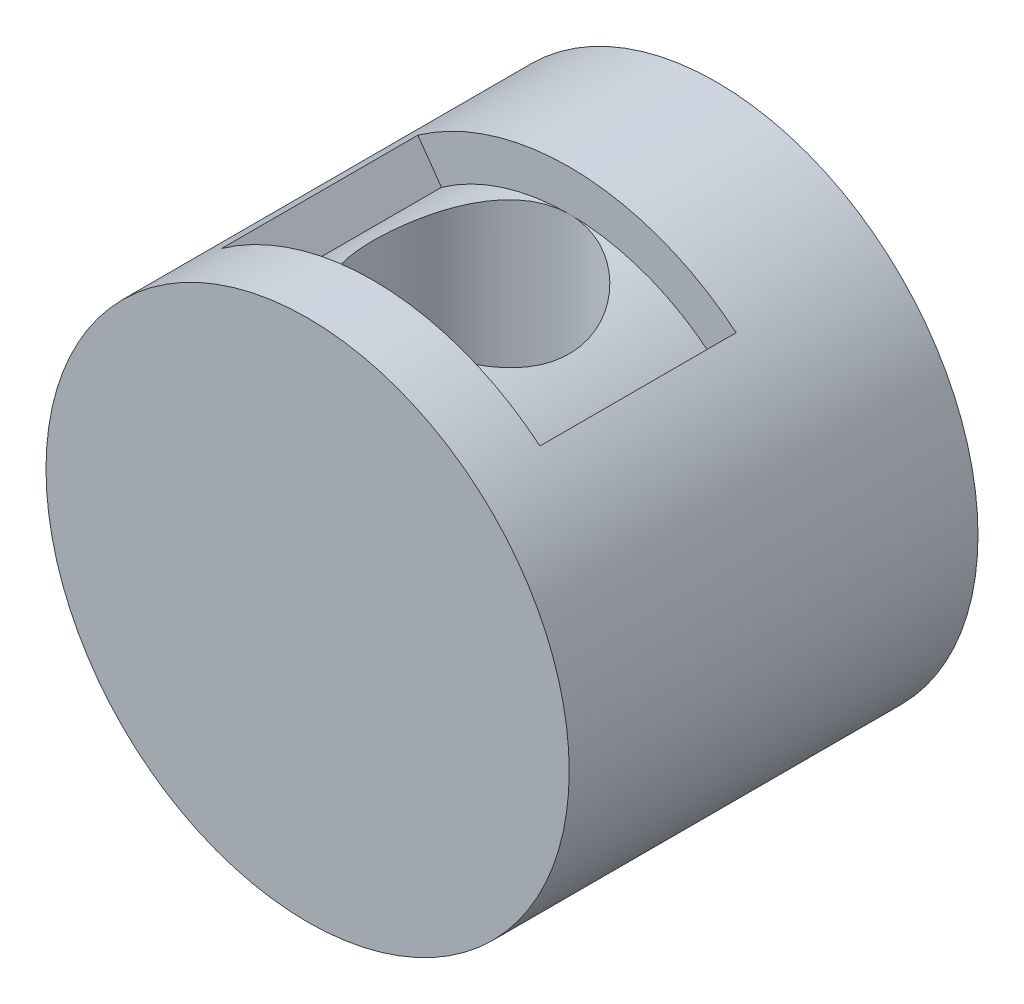
ISO-10303-21;
HEADER;
FILE_DESCRIPTION(('STEP AP214'),'2;1');
FILE_NAME('part.step','',(''),(''),'','','');
FILE_SCHEMA(('AUTOMOTIVE_DESIGN { 1 0 10303 214 1 1 1 1 }'));
ENDSEC;
DATA;
#1=APPLICATION_CONTEXT('core data for automotive mechanical design processes');
#2=APPLICATION_PROTOCOL_DEFINITION('international standard','automotive_design',2000,#1);
#3=PRODUCT_CONTEXT('',#1,'mechanical');
#4=PRODUCT('Part','Part','',(#3));
#5=PRODUCT_RELATED_PRODUCT_CATEGORY('part','',(#4));
#6=PRODUCT_DEFINITION_FORMATION('','',#4);
#7=PRODUCT_DEFINITION_CONTEXT('part definition',#1,'design');
#8=PRODUCT_DEFINITION('design','',#6,#7);
#9=PRODUCT_DEFINITION_SHAPE('','',#8);
#10=(LENGTH_UNIT() NAMED_UNIT(*) SI_UNIT(.MILLI.,.METRE.));
#11=(NAMED_UNIT(*) PLANE_ANGLE_UNIT() SI_UNIT($,.RADIAN.));
#12=(NAMED_UNIT(*) SI_UNIT($,.STERADIAN.) SOLID_ANGLE_UNIT());
#13=UNCERTAINTY_MEASURE_WITH_UNIT(LENGTH_MEASURE(1.E-05),#10,'distance_accuracy_value','');
#14=(GEOMETRIC_REPRESENTATION_CONTEXT(3) GLOBAL_UNCERTAINTY_ASSIGNED_CONTEXT((#13)) GLOBAL_UNIT_ASSIGNED_CONTEXT((#10,
#11,#12)) REPRESENTATION_CONTEXT('',''));
#15=CARTESIAN_POINT('',(0.,0.,0.));
#16=DIRECTION('',(0.,0.,1.));
#17=DIRECTION('',(1.,0.,0.));
#18=AXIS2_PLACEMENT_3D('',#15,#16,#17);
#19=CARTESIAN_POINT('',(0.,0.,-25.));
#20=DIRECTION('',(0.,0.,1.));
#21=DIRECTION('',(1.,0.,0.));
#22=AXIS2_PLACEMENT_3D('',#19,#20,#21);
#23=CYLINDRICAL_SURFACE('',#22,16.);
#24=CARTESIAN_POINT('',(0.,0.,-16.));
#25=DIRECTION('',(0.,0.,1.));
#26=DIRECTION('',(-1.,0.,0.));
#27=AXIS2_PLACEMENT_3D('',#24,#25,#26);
#28=CIRCLE('',#27,16.);
#29=CARTESIAN_POINT('',(10.2080669952522,12.3205262964064,-16.));
#30=VERTEX_POINT('',#29);
#31=CARTESIAN_POINT('',(-9.25867239111891,13.0490223983995,-16.));
#32=VERTEX_POINT('',#31);
#33=EDGE_CURVE('E85',#30,#32,#28,.T.);
#34=ORIENTED_EDGE('',*,*,#33,.F.);
#35=DIRECTION('',(0.,0.,1.));
#36=VECTOR('',#35,1.);
#37=CARTESIAN_POINT('',(10.2080669952522,12.3205262964064,-16.));
#38=LINE('',#37,#36);
#39=CARTESIAN_POINT('',(10.2080669952522,12.3205262964064,-4.));
#40=VERTEX_POINT('',#39);
#41=EDGE_CURVE('E121',#30,#40,#38,.T.);
#42=ORIENTED_EDGE('',*,*,#41,.T.);
#43=CARTESIAN_POINT('',(0.,0.,-4.));
#44=DIRECTION('',(0.,0.,1.));
#45=DIRECTION('',(-1.,0.,0.));
#46=AXIS2_PLACEMENT_3D('',#43,#44,#45);
#47=CIRCLE('',#46,16.);
#48=CARTESIAN_POINT('',(-9.25867239111891,13.0490223983995,-4.));
#49=VERTEX_POINT('',#48);
#50=EDGE_CURVE('E107',#40,#49,#47,.T.);
#51=ORIENTED_EDGE('',*,*,#50,.T.);
#52=DIRECTION('',(0.,0.,1.));
#53=VECTOR('',#52,1.);
#54=CARTESIAN_POINT('',(-9.25867239111891,13.0490223983995,-16.));
#55=LINE('',#54,#53);
#56=EDGE_CURVE('E100',#32,#49,#55,.T.);
#57=ORIENTED_EDGE('',*,*,#56,.F.);
#58=EDGE_LOOP('',(#34,#42,#51,#57));
#59=FACE_BOUND('',#58,.T.);
#60=CARTESIAN_POINT('',(0.,-16.,-4.));
#61=CARTESIAN_POINT('',(-0.162427733217201,-16.0000005574365,-3.99999923970433));
#62=CARTESIAN_POINT('',(-0.324844993204213,-15.997521305701,-4.00660069199163));
#63=CARTESIAN_POINT('',(-0.64852033165105,-15.9876715176004,-4.03294112510509));
#64=CARTESIAN_POINT('',(-0.809777999754456,-15.9802993282726,-4.05268454563962));
#65=CARTESIAN_POINT('',(-1.12979634025998,-15.9608661386765,-4.10510065368822));
#66=CARTESIAN_POINT('',(-1.28855831551786,-15.9488076755506,-4.13776634527305));
#67=CARTESIAN_POINT('',(-1.60261141357126,-15.920317470945,-4.21572612662779));
#68=CARTESIAN_POINT('',(-1.75790116237643,-15.9038840303219,-4.2610251232169));
#69=CARTESIAN_POINT('',(-2.06353693603205,-15.8671186446934,-4.36371175908523));
#70=CARTESIAN_POINT('',(-2.2138937515954,-15.8467959807585,-4.42107065068162));
#71=CARTESIAN_POINT('',(-2.50915130568742,-15.8027355385636,-4.54748133051894));
#72=CARTESIAN_POINT('',(-2.6540499966769,-15.7789964944816,-4.61653745445233));
#73=CARTESIAN_POINT('',(-2.93745114452686,-15.7287028027287,-4.76578318564374));
#74=CARTESIAN_POINT('',(-3.07595454319079,-15.7021485715472,-4.84597114655727));
#75=CARTESIAN_POINT('',(-3.3458591786585,-15.6468595232441,-5.01695291772351));
#76=CARTESIAN_POINT('',(-3.47725782650566,-15.618123920283,-5.10775055652774));
#77=CARTESIAN_POINT('',(-3.73705610176947,-15.5580480618583,-5.30299965868691));
#78=CARTESIAN_POINT('',(-3.86515055841849,-15.5266502766542,-5.40783961718783));
#79=CARTESIAN_POINT('',(-4.11214204970197,-15.4630706424826,-5.62763013050399));
#80=CARTESIAN_POINT('',(-4.23103881568697,-15.4308887706492,-5.74258098043238));
#81=CARTESIAN_POINT('',(-4.45900396938853,-15.3665649618726,-5.98196396263458));
#82=CARTESIAN_POINT('',(-4.56806779232923,-15.334423050239,-6.10640044948695));
#83=CARTESIAN_POINT('',(-4.7756151663689,-15.2710599351284,-6.36395223008506));
#84=CARTESIAN_POINT('',(-4.87410227927999,-15.2398384242831,-6.49706457772916));
#85=CARTESIAN_POINT('',(-5.06349317838993,-15.1779887662079,-6.77655176135364));
#86=CARTESIAN_POINT('',(-5.15395768486008,-15.1474300063047,-6.92324016218164));
#87=CARTESIAN_POINT('',(-5.32210766389307,-15.0891712380417,-7.22423433045981));
#88=CARTESIAN_POINT('',(-5.39979826063104,-15.0614700850402,-7.37853701103515));
#89=CARTESIAN_POINT('',(-5.54178841369625,-15.0098065930345,-7.69381841492035));
#90=CARTESIAN_POINT('',(-5.60608640345173,-14.9858446915035,-7.85479791659921));
#91=CARTESIAN_POINT('',(-5.72063465547911,-14.9424928843857,-8.18219942581004));
#92=CARTESIAN_POINT('',(-5.77089169343533,-14.9231007742832,-8.34861876480259));
#93=CARTESIAN_POINT('',(-5.85511762079081,-14.8902504435595,-8.67884743331591));
#94=CARTESIAN_POINT('',(-5.8896649062008,-14.8765832940335,-8.84248846483376));
#95=CARTESIAN_POINT('',(-5.94499608898466,-14.8545586136563,-9.17236692151272));
#96=CARTESIAN_POINT('',(-5.96578600537438,-14.8461987608635,-9.33860317860256));
#97=CARTESIAN_POINT('',(-5.99338932391421,-14.8350769098856,-9.67239457477123));
#98=CARTESIAN_POINT('',(-6.00020481754232,-14.8323140740252,-9.83994951272138));
#99=CARTESIAN_POINT('',(-5.99978582609108,-14.8324836592826,-10.1750355773502));
#100=CARTESIAN_POINT('',(-5.99255188597222,-14.8354158594969,-10.3425667047004));
#101=CARTESIAN_POINT('',(-5.9649764539924,-14.8465233912792,-10.6662031836985));
#102=CARTESIAN_POINT('',(-5.94544909811054,-14.8543729222115,-10.8223899488207));
#103=CARTESIAN_POINT('',(-5.89424692585002,-14.8747642678531,-11.1325008569329));
#104=CARTESIAN_POINT('',(-5.86256807516545,-14.887307640888,-11.286424230834));
#105=CARTESIAN_POINT('',(-5.78737202482784,-14.9167004061573,-11.5908827856636));
#106=CARTESIAN_POINT('',(-5.74385788753069,-14.9335486844382,-11.7414188321617));
#107=CARTESIAN_POINT('',(-5.64535023739173,-14.9710653122174,-12.038255531066));
#108=CARTESIAN_POINT('',(-5.59035233353468,-14.9917351225968,-12.1845545389312));
#109=CARTESIAN_POINT('',(-5.46820476177672,-15.0367233176973,-12.4746646380402));
#110=CARTESIAN_POINT('',(-5.40084887641492,-15.0611021931745,-12.6183794500344));
#111=CARTESIAN_POINT('',(-5.25517504141257,-15.112547805852,-12.8996957820447));
#112=CARTESIAN_POINT('',(-5.17685336615087,-15.1396154556501,-13.0372952033402));
#113=CARTESIAN_POINT('',(-5.00978390525085,-15.1957174270412,-13.3056080042885));
#114=CARTESIAN_POINT('',(-4.92103495161993,-15.2247519687976,-13.4363206101472));
#115=CARTESIAN_POINT('',(-4.73365945980357,-15.2840480047093,-13.6901705195919));
#116=CARTESIAN_POINT('',(-4.63503247524756,-15.3143095542741,-13.8133074804417));
#117=CARTESIAN_POINT('',(-4.42148606838323,-15.3773753801615,-14.0594039061218));
#118=CARTESIAN_POINT('',(-4.30591643878468,-15.4102134955816,-14.1817912651599));
#119=CARTESIAN_POINT('',(-4.06489568201331,-15.4755357173162,-14.4164355543738));
#120=CARTESIAN_POINT('',(-3.93944756276282,-15.5080199279887,-14.5286955460854));
#121=CARTESIAN_POINT('',(-3.67930542713133,-15.5717902850822,-14.7424749779438));
#122=CARTESIAN_POINT('',(-3.54460652130529,-15.6030757841096,-14.843988665036));
#123=CARTESIAN_POINT('',(-3.26687700935565,-15.6635788517399,-15.0354694231667));
#124=CARTESIAN_POINT('',(-3.1238497570632,-15.6927972424122,-15.1254410960648));
#125=CARTESIAN_POINT('',(-2.8279450922801,-15.7488334975338,-15.2945466806689));
#126=CARTESIAN_POINT('',(-2.67494692833352,-15.7756056227759,-15.3734847687455));
#127=CARTESIAN_POINT('',(-2.3622882806369,-15.8254428006133,-15.5180835965381));
#128=CARTESIAN_POINT('',(-2.20263047079285,-15.8485093233326,-15.5837496043699));
#129=CARTESIAN_POINT('',(-1.87775996874067,-15.8902747413691,-15.7012144570176));
#130=CARTESIAN_POINT('',(-1.71254812449194,-15.9089742999771,-15.7530154079486));
#131=CARTESIAN_POINT('',(-1.37781252548076,-15.941452244328,-15.8422280588219));
#132=CARTESIAN_POINT('',(-1.20828902944486,-15.9552309246121,-15.8796406199975));
#133=CARTESIAN_POINT('',(-0.87539769177806,-15.9768584541714,-15.9380721267269));
#134=CARTESIAN_POINT('',(-0.712181926506242,-15.9849836851652,-15.9598570805066));
#135=CARTESIAN_POINT('',(-0.38434283927786,-15.9962238192193,-15.9899392959296));
#136=CARTESIAN_POINT('',(-0.219719576503014,-15.9993389319109,-15.998237121896));
#137=CARTESIAN_POINT('',(0.109636493119357,-16.0004717193297,-16.0012579389532));
#138=CARTESIAN_POINT('',(0.274369272946655,-15.9984903702625,-15.9959835297477));
#139=CARTESIAN_POINT('',(0.60270387890118,-15.9894877259905,-15.9719211609801));
#140=CARTESIAN_POINT('',(0.766305722205483,-15.9824665075037,-15.9531334071208));
#141=CARTESIAN_POINT('',(1.08484961913033,-15.9639458569047,-15.9032262388231));
#142=CARTESIAN_POINT('',(1.23988188497638,-15.9526301176627,-15.8726118420762));
#143=CARTESIAN_POINT('',(1.54675761268309,-15.9258052315377,-15.7993477325953));
#144=CARTESIAN_POINT('',(1.69860000629036,-15.9102947032516,-15.7566940549543));
#145=CARTESIAN_POINT('',(1.99802063532092,-15.8754724865307,-15.6597412833849));
#146=CARTESIAN_POINT('',(2.14560001979059,-15.85616183355,-15.6054453613632));
#147=CARTESIAN_POINT('',(2.43569439144994,-15.8141987820697,-15.4856204811243));
#148=CARTESIAN_POINT('',(2.5782074312085,-15.791545115435,-15.420087258627));
#149=CARTESIAN_POINT('',(2.8613459347381,-15.7427421936757,-15.2762335946687));
#150=CARTESIAN_POINT('',(3.00179672915217,-15.7165106018511,-15.1975973698788));
#151=CARTESIAN_POINT('',(3.27565209358175,-15.6617244709423,-15.029505655045));
#152=CARTESIAN_POINT('',(3.40905422018787,-15.6331691349365,-14.9400464481271));
#153=CARTESIAN_POINT('',(3.66805220697512,-15.574435140652,-14.7509062718012));
#154=CARTESIAN_POINT('',(3.79364691977775,-15.5442562449847,-14.6512238056588));
#155=CARTESIAN_POINT('',(4.03634135503765,-15.4830105314732,-14.4422509766466));
#156=CARTESIAN_POINT('',(4.15344076684119,-15.4519436812165,-14.3329602627481));
#157=CARTESIAN_POINT('',(4.3850769922395,-15.3878643733323,-14.0987537508066));
#158=CARTESIAN_POINT('',(4.49906697777691,-15.3548440197118,-13.9732985806097));
#159=CARTESIAN_POINT('',(4.71608180551253,-15.2895850482594,-13.713120150123));
#160=CARTESIAN_POINT('',(4.81911014985825,-15.2573461833059,-13.5783998727378));
#161=CARTESIAN_POINT('',(5.01360921148213,-15.194544233745,-13.3003812668984));
#162=CARTESIAN_POINT('',(5.10507411943373,-15.163981995784,-13.1570786796551));
#163=CARTESIAN_POINT('',(5.27567954502637,-15.1054737865422,-12.862884224216));
#164=CARTESIAN_POINT('',(5.35482524492546,-15.0775267171356,-12.7119955827398));
#165=CARTESIAN_POINT('',(5.50053123003078,-15.0249854035085,-12.4028100253804));
#166=CARTESIAN_POINT('',(5.5670312831168,-15.0004073538345,-12.2444819242356));
#167=CARTESIAN_POINT('',(5.68634828102296,-14.9555845073613,-11.9222252160356));
#168=CARTESIAN_POINT('',(5.73917096081639,-14.9353378949951,-11.758298989037));
#169=CARTESIAN_POINT('',(5.8306145608513,-14.89987725389,-11.4260475665688));
#170=CARTESIAN_POINT('',(5.86923979289934,-14.884661697346,-11.2577237233296));
#171=CARTESIAN_POINT('',(5.93187603774561,-14.8598111531835,-10.9179750500521));
#172=CARTESIAN_POINT('',(5.95588806980647,-14.8501757763528,-10.7465504371498));
#173=CARTESIAN_POINT('',(5.98795090417701,-14.8372746439933,-10.4131192051757));
#174=CARTESIAN_POINT('',(5.99692832454356,-14.8336393231868,-10.2512153590039));
#175=CARTESIAN_POINT('',(6.00174553399867,-14.8316910415951,-9.92718205276537));
#176=CARTESIAN_POINT('',(5.99758576142358,-14.8333779032297,-9.76505260040671));
#177=CARTESIAN_POINT('',(5.97617513263579,-14.8420167875276,-9.44182064312518));
#178=CARTESIAN_POINT('',(5.9589255469707,-14.8489682991837,-9.28071804006268));
#179=CARTESIAN_POINT('',(5.91152013228679,-14.8679043387426,-8.96072591141225));
#180=CARTESIAN_POINT('',(5.88136431225468,-14.8798888631408,-8.80183638428341));
#181=CARTESIAN_POINT('',(5.80957518001795,-14.9080606391937,-8.49225188027361));
#182=CARTESIAN_POINT('',(5.76832374784491,-14.9241071644574,-8.34145521233002));
#183=CARTESIAN_POINT('',(5.67433519717346,-14.9600952888499,-8.04391392505794));
#184=CARTESIAN_POINT('',(5.62159429697566,-14.9800381702209,-7.89717065784727));
#185=CARTESIAN_POINT('',(5.50506367949973,-15.0232530212263,-7.6086684329375));
#186=CARTESIAN_POINT('',(5.44127561377937,-15.0465244931439,-7.46690873399754));
#187=CARTESIAN_POINT('',(5.30311395585866,-15.0957729106071,-7.18911402085867));
#188=CARTESIAN_POINT('',(5.22873653386789,-15.1217508340634,-7.05308110099436));
#189=CARTESIAN_POINT('',(4.98217098059621,-15.2055628910557,-6.64085833005099));
#190=CARTESIAN_POINT('',(4.79257489281544,-15.2669336680249,-6.3755477447751));
#191=CARTESIAN_POINT('',(4.37331782889985,-15.3922641444428,-5.87936280156253));
#192=CARTESIAN_POINT('',(4.14364411917575,-15.4562246617369,-5.64849943168187));
#193=CARTESIAN_POINT('',(3.76647526932395,-15.5509413309461,-5.32634385564913));
#194=CARTESIAN_POINT('',(3.63140882550666,-15.5831105995963,-5.2206354645851));
#195=CARTESIAN_POINT('',(3.35244180363032,-15.6454953637792,-5.02099221149403));
#196=CARTESIAN_POINT('',(3.2085445417169,-15.6757115840734,-4.92705296973959));
#197=CARTESIAN_POINT('',(2.91272701664921,-15.7333640871372,-4.7516082350759));
#198=CARTESIAN_POINT('',(2.76080251205564,-15.7607988774506,-4.67010940569264));
#199=CARTESIAN_POINT('',(2.4500690484255,-15.8120821692567,-4.52031994656087));
#200=CARTESIAN_POINT('',(2.29126304435573,-15.8359321907958,-4.45202371499039));
#201=CARTESIAN_POINT('',(1.96075860802517,-15.8803154092505,-4.32655175091214));
#202=CARTESIAN_POINT('',(1.78880001796275,-15.9006582737851,-4.2699919057583));
#203=CARTESIAN_POINT('',(1.43995213398727,-15.9360368992552,-4.17253607216013));
#204=CARTESIAN_POINT('',(1.26306259308868,-15.9510723938335,-4.13164086985717));
#205=CARTESIAN_POINT('',(0.905989966629826,-15.9753306460174,-4.06601991263082));
#206=CARTESIAN_POINT('',(0.725808299297165,-15.9845558486144,-4.04128735624406));
#207=CARTESIAN_POINT('',(0.363746582032714,-15.9968898686006,-4.00827875362891));
#208=CARTESIAN_POINT('',(0.181866725985323,-15.9999993758507,-4.00000085128618));
#209=CARTESIAN_POINT('',(0.,-16.,-4.));
#210=B_SPLINE_CURVE_WITH_KNOTS('',3,(#60,#61,#62,#63,#64,#65,#66,#67,#68,#69,#70,#71,#72,#73,
#74,#75,#76,#77,#78,#79,#80,#81,#82,#83,#84,#85,#86,#87,#88,#89,#90,#91,#92,#93,#94,#95,#96,#97,
#98,#99,#100,#101,#102,#103,#104,#105,#106,#107,#108,#109,#110,#111,#112,#113,#114,#115,#116,
#117,#118,#119,#120,#121,#122,#123,#124,#125,#126,#127,#128,#129,#130,#131,#132,#133,#134,#135,
#136,#137,#138,#139,#140,#141,#142,#143,#144,#145,#146,#147,#148,#149,#150,#151,#152,#153,#154,
#155,#156,#157,#158,#159,#160,#161,#162,#163,#164,#165,#166,#167,#168,#169,#170,#171,#172,#173,
#174,#175,#176,#177,#178,#179,#180,#181,#182,#183,#184,#185,#186,#187,#188,#189,#190,#191,#192,
#193,#194,#195,#196,#197,#198,#199,#200,#201,#202,#203,#204,#205,#206,#207,#208,#209),
.UNSPECIFIED.,.T.,.F.,(4,2,2,2,2,2,2,2,2,2,2,2,2,2,2,2,2,2,2,2,2,2,2,2,2,2,2,2,2,2,2,2,2,2,2,2,
2,2,2,2,2,2,2,2,2,2,2,2,2,2,2,2,2,2,2,2,2,2,2,2,2,2,2,2,2,2,2,2,2,2,2,2,2,2,4),(0.,
0.48711292204893,0.974390487445855,1.46140460810819,1.94860815080488,2.43466323215078,
2.92089887034217,3.40706267311052,3.89340245529402,4.39827808037434,4.90316844648054,
5.40829200524658,5.91324492166594,6.43768308370423,6.96191035461704,7.48619891150762,
8.01023402589576,8.51299593876265,9.01553774150439,9.51800432597829,10.0204514207721,
10.4926927079049,10.9650909154106,11.4373670069502,11.9098240131363,12.3910323498091,
12.8724045752803,13.3538307722826,13.8352787338992,14.3491981171849,14.8629616167018,
15.3769987841633,15.8908303611703,16.4128602626089,16.9346825448756,17.4564255168104,
17.9781372543704,18.4721042492951,18.9660505753119,19.4599022950596,19.9537464974543,
20.4284916754825,20.9033933845505,21.3781658716042,21.8531189235062,22.3418491774121,
22.830747752114,23.319718006378,23.8087061321625,24.3261847888275,24.8434976160001,
25.3610693105782,25.8784226890544,26.3981817069137,26.9177224336738,27.4371052437639,
27.9564518230364,28.4424210177993,28.9283739978568,29.4142798154816,29.9001852947673,
30.3711334028341,30.8422367558885,31.3132697394161,31.7844735134835,32.7753369225941,
33.7665157271057,34.2894950202014,34.8122791119684,35.3353422501841,35.8581829648323,
36.4038564254464,36.9495572674889,37.4950283229957,38.0404378449011),.UNSPECIFIED.);
#211=CARTESIAN_POINT('',(0.,-16.,-4.));
#212=VERTEX_POINT('',#211);
#213=EDGE_CURVE('E118',#212,#212,#210,.T.);
#214=ORIENTED_EDGE('',*,*,#213,.F.);
#215=EDGE_LOOP('',(#214));
#216=FACE_BOUND('',#215,.T.);
#217=CARTESIAN_POINT('',(0.,0.,-25.));
#218=DIRECTION('',(0.,0.,1.));
#219=DIRECTION('',(1.,0.,0.));
#220=AXIS2_PLACEMENT_3D('',#217,#218,#219);
#221=CIRCLE('',#220,16.);
#222=CARTESIAN_POINT('',(16.,0.,-25.));
#223=VERTEX_POINT('',#222);
#224=EDGE_CURVE('E115',#223,#223,#221,.T.);
#225=ORIENTED_EDGE('',*,*,#224,.T.);
#226=EDGE_LOOP('',(#225));
#227=FACE_BOUND('',#226,.T.);
#228=CARTESIAN_POINT('',(0.,0.,0.));
#229=DIRECTION('',(0.,0.,1.));
#230=DIRECTION('',(1.,0.,0.));
#231=AXIS2_PLACEMENT_3D('',#228,#229,#230);
#232=CIRCLE('',#231,16.);
#233=CARTESIAN_POINT('',(16.,0.,0.));
#234=VERTEX_POINT('',#233);
#235=EDGE_CURVE('E119',#234,#234,#232,.T.);
#236=ORIENTED_EDGE('',*,*,#235,.F.);
#237=EDGE_LOOP('',(#236));
#238=FACE_BOUND('',#237,.T.);
#239=ADVANCED_FACE('F33',(#59,#216,#227,#238),#23,.T.);
#240=CARTESIAN_POINT('',(0.,0.,-25.));
#241=DIRECTION('',(0.,0.,1.));
#242=DIRECTION('',(1.,0.,0.));
#243=AXIS2_PLACEMENT_3D('',#240,#241,#242);
#244=PLANE('',#243);
#245=ORIENTED_EDGE('',*,*,#224,.F.);
#246=EDGE_LOOP('',(#245));
#247=FACE_BOUND('',#246,.T.);
#248=ADVANCED_FACE('F134',(#247),#244,.F.);
#249=CARTESIAN_POINT('',(0.,0.,0.));
#250=DIRECTION('',(0.,0.,1.));
#251=DIRECTION('',(1.,0.,0.));
#252=AXIS2_PLACEMENT_3D('',#249,#250,#251);
#253=PLANE('',#252);
#254=ORIENTED_EDGE('',*,*,#235,.T.);
#255=EDGE_LOOP('',(#254));
#256=FACE_BOUND('',#255,.T.);
#257=ADVANCED_FACE('F132',(#256),#253,.T.);
#258=CARTESIAN_POINT('',(0.,-16.,-10.));
#259=DIRECTION('',(0.,1.,0.));
#260=DIRECTION('',(0.,0.,1.));
#261=AXIS2_PLACEMENT_3D('',#258,#259,#260);
#262=CYLINDRICAL_SURFACE('',#261,6.);
#263=ORIENTED_EDGE('',*,*,#213,.T.);
#264=EDGE_LOOP('',(#263));
#265=FACE_BOUND('',#264,.T.);
#266=CARTESIAN_POINT('',(0.,13.5,-4.));
#267=CARTESIAN_POINT('',(0.159815210969401,13.4999990023594,-4.00000119600847));
#268=CARTESIAN_POINT('',(0.319671160641117,13.4971546401535,-4.00639358197203));
#269=CARTESIAN_POINT('',(0.638232282836287,13.4858478061665,-4.03189997564832));
#270=CARTESIAN_POINT('',(0.796936745632226,13.4773821252071,-4.05102125022564));
#271=CARTESIAN_POINT('',(1.11224390801772,13.4550338332983,-4.10182595626985));
#272=CARTESIAN_POINT('',(1.26884210820012,13.441141094058,-4.13353287759474));
#273=CARTESIAN_POINT('',(1.57857007218602,13.4082954714682,-4.20918425354803));
#274=CARTESIAN_POINT('',(1.73169839035063,13.3893405196472,-4.25313371091819));
#275=CARTESIAN_POINT('',(2.03280607374336,13.3469364573837,-4.35263500233163));
#276=CARTESIAN_POINT('',(2.18080363392697,13.323505685134,-4.40813957372186));
#277=CARTESIAN_POINT('',(2.47141118346426,13.2726763214689,-4.53035522493719));
#278=CARTESIAN_POINT('',(2.6140191299091,13.2452762441537,-4.59707050296648));
#279=CARTESIAN_POINT('',(3.03232699373676,13.1581091147488,-4.81316170539562));
#280=CARTESIAN_POINT('',(3.29889055140691,13.0933192244489,-4.97860957165915));
#281=CARTESIAN_POINT('',(3.8144814785088,12.9527963287675,-5.35701197724306));
#282=CARTESIAN_POINT('',(4.06193039725338,12.8766746410873,-5.57195269309166));
#283=CARTESIAN_POINT('',(4.51878447038183,12.7235466931707,-6.03928504994831));
#284=CARTESIAN_POINT('',(4.72816694690017,12.6465399345107,-6.2916988537493));
#285=CARTESIAN_POINT('',(5.01527172091192,12.5342923378452,-6.70194566146534));
#286=CARTESIAN_POINT('',(5.10858785959446,12.4964482133758,-6.84839935310804));
#287=CARTESIAN_POINT('',(5.28245821062867,12.4239482838914,-7.14942090956125));
#288=CARTESIAN_POINT('',(5.36301775417484,12.3892911495324,-7.30398534860731));
#289=CARTESIAN_POINT('',(5.51067003429441,12.3243268350755,-7.62029658599188));
#290=CARTESIAN_POINT('',(5.57776271244028,12.2940196738507,-7.78204341548829));
#291=CARTESIAN_POINT('',(5.6977567755943,12.2388696847278,-8.11153961896141));
#292=CARTESIAN_POINT('',(5.75066579374026,12.2140239190038,-8.27928570903467));
#293=CARTESIAN_POINT('',(5.83932061698515,12.1718781898458,-8.61068228352352));
#294=CARTESIAN_POINT('',(5.87581740356298,12.1542523637108,-8.77409036346968));
#295=CARTESIAN_POINT('',(5.93506488802422,12.1254317261593,-9.1038682830658));
#296=CARTESIAN_POINT('',(5.95782220775819,12.114233816883,-9.2702366561113));
#297=CARTESIAN_POINT('',(5.9893076945348,12.0986984115043,-9.60455798444705));
#298=CARTESIAN_POINT('',(5.99804075996539,12.0943585200438,-9.77251036584918));
#299=CARTESIAN_POINT('',(6.00137012368578,12.0927069996921,-10.1085844371433));
#300=CARTESIAN_POINT('',(5.99596733024978,12.0953949192417,-10.2767061154637));
#301=CARTESIAN_POINT('',(5.97222312951707,12.1071342977929,-10.5965883741833));
#302=CARTESIAN_POINT('',(5.95508746585796,12.1155924938141,-10.7484621549568));
#303=CARTESIAN_POINT('',(5.9093602514049,12.1379614802191,-11.0501151627545));
#304=CARTESIAN_POINT('',(5.88076499925605,12.1518740322846,-11.1998936968391));
#305=CARTESIAN_POINT('',(5.81242040831924,12.1847119038091,-11.4962915764018));
#306=CARTESIAN_POINT('',(5.77267332054638,12.2036362115943,-11.642911553015));
#307=CARTESIAN_POINT('',(5.68240705852885,12.2459268418589,-11.9321595699995));
#308=CARTESIAN_POINT('',(5.63188370681305,12.2692948865925,-12.0747860379416));
#309=CARTESIAN_POINT('',(5.46230629328935,12.3462102066449,-12.5016301842429));
#310=CARTESIAN_POINT('',(5.32673056767255,12.4058164926441,-12.7783964400476));
#311=CARTESIAN_POINT('',(5.01622702214445,12.5345770129052,-13.3062751587822));
#312=CARTESIAN_POINT('',(4.84128263371796,12.6037352624159,-13.5573767557109));
#313=CARTESIAN_POINT('',(4.4370417065408,12.7519957260556,-14.0527201088373));
#314=CARTESIAN_POINT('',(4.20411061417191,12.8314103407207,-14.2939107240207));
#315=CARTESIAN_POINT('',(3.70026128885575,12.9856558113087,-14.7349820508702));
#316=CARTESIAN_POINT('',(3.42933161286528,13.0604852766516,-14.9348502735234));
#317=CARTESIAN_POINT('',(2.99501791072232,13.1644623810303,-15.2019235514786));
#318=CARTESIAN_POINT('',(2.84314380944269,13.1981743146028,-15.2864798290935));
#319=CARTESIAN_POINT('',(2.53194303048995,13.261388068596,-15.4423803851933));
#320=CARTESIAN_POINT('',(2.37261945454435,13.2908916208889,-15.5137301021838));
#321=CARTESIAN_POINT('',(2.04766024352034,13.3448198852373,-15.642484641047));
#322=CARTESIAN_POINT('',(1.88202643288225,13.3692460522968,-15.6998934586978));
#323=CARTESIAN_POINT('',(1.5456717751798,13.4122939519179,-15.800145019346));
#324=CARTESIAN_POINT('',(1.37495137715459,13.4309161951908,-15.8429890439901));
#325=CARTESIAN_POINT('',(1.04193064448379,13.4606963802061,-15.9111094890314));
#326=CARTESIAN_POINT('',(0.879876747362771,13.4722853580604,-15.9374051915051));
#327=CARTESIAN_POINT('',(0.553853344388532,13.4896214369916,-15.9766377001701));
#328=CARTESIAN_POINT('',(0.389883963096185,13.4953689158164,-15.989575370176));
#329=CARTESIAN_POINT('',(0.0613831091741108,13.5008596732292,-16.0019365458027));
#330=CARTESIAN_POINT('',(-0.103148191908051,13.5006046445291,-16.001363861354));
#331=CARTESIAN_POINT('',(-0.431486933033637,13.4941016010172,-15.9867204427916));
#332=CARTESIAN_POINT('',(-0.59529439337915,13.487853755376,-15.972650089702));
#333=CARTESIAN_POINT('',(-0.911366472283421,13.4700775923219,-15.9323935560209));
#334=CARTESIAN_POINT('',(-1.06374668526907,13.4588788303041,-15.9069626234985));
#335=CARTESIAN_POINT('',(-1.36572320669345,13.4315967334787,-15.8445341342054));
#336=CARTESIAN_POINT('',(-1.51531859972048,13.4155118215931,-15.8075328428146));
#337=CARTESIAN_POINT('',(-1.81066818450627,13.3788497479644,-15.7223332411606));
#338=CARTESIAN_POINT('',(-1.9564234765744,13.3582738890578,-15.6741381779834));
#339=CARTESIAN_POINT('',(-2.24332140321748,13.3130992093092,-15.566953537286));
#340=CARTESIAN_POINT('',(-2.38446225302374,13.288498853456,-15.5079598399595));
#341=CARTESIAN_POINT('',(-2.66557134767955,13.2350223869603,-15.3776812697935));
#342=CARTESIAN_POINT('',(-2.80536965736704,13.2060379403574,-15.3060738565246));
#343=CARTESIAN_POINT('',(-3.07846057430415,13.1450633996234,-15.1524414215283));
#344=CARTESIAN_POINT('',(-3.21175076369675,13.1130722011597,-15.0704125682487));
#345=CARTESIAN_POINT('',(-3.60080631821242,13.0136727798252,-14.8095344691828));
#346=CARTESIAN_POINT('',(-3.84591022554656,12.942808298608,-14.6158220598847));
#347=CARTESIAN_POINT('',(-4.32117303988917,12.7923648915555,-14.1761844312062));
#348=CARTESIAN_POINT('',(-4.54853535518361,12.7125439298059,-13.9273093845209));
#349=CARTESIAN_POINT('',(-4.85639105001954,12.5967279620797,-13.5275843546037));
#350=CARTESIAN_POINT('',(-4.95353564092578,12.558749574153,-13.3898330852285));
#351=CARTESIAN_POINT('',(-5.13613472034807,12.4851828649547,-13.1062081727919));
#352=CARTESIAN_POINT('',(-5.22159381623493,12.4495936045289,-12.9603377630603));
#353=CARTESIAN_POINT('',(-5.38208585896048,12.3810725594834,-12.6576684885934));
#354=CARTESIAN_POINT('',(-5.45681851698225,12.3482253051908,-12.5006911366839));
#355=CARTESIAN_POINT('',(-5.59262125542859,12.287315702047,-12.1801080181812));
#356=CARTESIAN_POINT('',(-5.65369737997694,12.2592512377365,-12.0165052219024));
#357=CARTESIAN_POINT('',(-5.76152155001233,12.2089480579691,-11.6838700013074));
#358=CARTESIAN_POINT('',(-5.80827794134763,12.1867059502201,-11.5148408033293));
#359=CARTESIAN_POINT('',(-5.88691439761464,12.1489155984571,-11.1726256907823));
#360=CARTESIAN_POINT('',(-5.91879614329252,12.1333665981773,-10.9994402481707));
#361=CARTESIAN_POINT('',(-5.9651859254284,12.1106218583568,-10.6652496056357));
#362=CARTESIAN_POINT('',(-5.98093786320994,12.1028296361236,-10.5044567231364));
#363=CARTESIAN_POINT('',(-5.99941490684563,12.0936814249214,-10.1819451311997));
#364=CARTESIAN_POINT('',(-6.00214085030992,12.0923250221099,-10.0202264819615));
#365=CARTESIAN_POINT('',(-5.99453181497848,12.0960987579208,-9.69720500882288));
#366=CARTESIAN_POINT('',(-5.98419924782208,12.1012276988332,-9.53590211365338));
#367=CARTESIAN_POINT('',(-5.95061142218274,12.1177791816603,-9.21498048951158));
#368=CARTESIAN_POINT('',(-5.92735636594716,12.1292016250767,-9.05536173422098));
#369=CARTESIAN_POINT('',(-5.86999488367666,12.1570600880328,-8.74859667349582));
#370=CARTESIAN_POINT('',(-5.8366297083441,12.1731511534256,-8.60127984101877));
#371=CARTESIAN_POINT('',(-5.75908004510234,12.2100298390177,-8.31010957599423));
#372=CARTESIAN_POINT('',(-5.71489210174302,12.230818959029,-8.16625726572833));
#373=CARTESIAN_POINT('',(-5.5666634036131,12.2993572890405,-7.74120762615179));
#374=CARTESIAN_POINT('',(-5.44691849018401,12.3532976090957,-7.46631029757591));
#375=CARTESIAN_POINT('',(-5.16036070833355,12.4758326772199,-6.92244943989582));
#376=CARTESIAN_POINT('',(-4.99102342790838,12.5451449886853,-6.65499494426646));
#377=CARTESIAN_POINT('',(-4.61317596674146,12.688946116089,-6.15060765887549));
#378=CARTESIAN_POINT('',(-4.40464942419015,12.7634370859412,-5.91368768740684));
#379=CARTESIAN_POINT('',(-4.0560083723256,12.8769388534848,-5.57527643240384));
#380=CARTESIAN_POINT('',(-3.92801981060372,12.9166494729281,-5.46126847597384));
#381=CARTESIAN_POINT('',(-3.6624741462479,12.9944369865693,-5.24441059594914));
#382=CARTESIAN_POINT('',(-3.52492041550896,13.0325144489082,-5.14155677271934));
#383=CARTESIAN_POINT('',(-3.24087995087654,13.1060384091128,-4.94764379215797));
#384=CARTESIAN_POINT('',(-3.09438501538115,13.141482423238,-4.85659571061497));
#385=CARTESIAN_POINT('',(-2.79351632493551,13.2087095650471,-4.6871804098332));
#386=CARTESIAN_POINT('',(-2.63914625734765,13.2404943837743,-4.60880732619739));
#387=CARTESIAN_POINT('',(-2.32517718799502,13.2992022188371,-4.46619856764793));
#388=CARTESIAN_POINT('',(-2.16565241491287,13.3261739135017,-4.40181971304196));
#389=CARTESIAN_POINT('',(-1.84101600093655,13.3748861444868,-4.28683163977832));
#390=CARTESIAN_POINT('',(-1.67590709245512,13.3966291982091,-4.23621579318875));
#391=CARTESIAN_POINT('',(-1.34171535130939,13.4342104258613,-4.14939851752396));
#392=CARTESIAN_POINT('',(-1.17264305518218,13.4500627047652,-4.11316264246412));
#393=CARTESIAN_POINT('',(-0.831621218350239,13.4754442499507,-4.05539937393299));
#394=CARTESIAN_POINT('',(-0.659673761888109,13.4849779089227,-4.03386176195231));
#395=CARTESIAN_POINT('',(-0.40608436886278,13.494134941762,-4.01320581583888));
#396=CARTESIAN_POINT('',(-0.324967024104948,13.4963325701048,-4.00825558406939));
#397=CARTESIAN_POINT('',(-0.16256996754062,13.4992653614433,-4.00165235282413));
#398=CARTESIAN_POINT('',(-0.0812902538590729,13.5000005074514,-3.99999939164844));
#399=CARTESIAN_POINT('',(0.,13.5,-4.));
#400=B_SPLINE_CURVE_WITH_KNOTS('',3,(#266,#267,#268,#269,#270,#271,#272,#273,#274,#275,#276,
#277,#278,#279,#280,#281,#282,#283,#284,#285,#286,#287,#288,#289,#290,#291,#292,#293,#294,#295,
#296,#297,#298,#299,#300,#301,#302,#303,#304,#305,#306,#307,#308,#309,#310,#311,#312,#313,#314,
#315,#316,#317,#318,#319,#320,#321,#322,#323,#324,#325,#326,#327,#328,#329,#330,#331,#332,#333,
#334,#335,#336,#337,#338,#339,#340,#341,#342,#343,#344,#345,#346,#347,#348,#349,#350,#351,#352,
#353,#354,#355,#356,#357,#358,#359,#360,#361,#362,#363,#364,#365,#366,#367,#368,#369,#370,#371,
#372,#373,#374,#375,#376,#377,#378,#379,#380,#381,#382,#383,#384,#385,#386,#387,#388,#389,#390,
#391,#392,#393,#394,#395,#396,#397,#398,#399),.UNSPECIFIED.,.T.,.F.,(4,2,2,2,2,2,2,2,2,2,2,2,2,
2,2,2,2,2,2,2,2,2,2,2,2,2,2,2,2,2,2,2,2,2,2,2,2,2,2,2,2,2,2,2,2,2,2,2,2,2,2,2,2,2,2,2,2,2,2,2,2,
2,2,2,2,2,4),(0.,0.479363993241737,0.959001888170563,1.43953922077753,1.9202732070589,
2.39907822716853,2.87806295221095,3.83483431636347,4.84020339871599,5.84616947521242,
6.37880971036676,6.91122675540281,7.44364611034161,7.97577835841143,8.48016847845715,
8.98431530901596,9.48828601296961,9.99222433598682,10.4508985714052,10.9097210744682,
11.3684510300533,11.8273591387902,12.7648348008276,13.7027057449015,14.7319396437032,
15.7614841582331,16.292096851205,16.8224905475853,17.3527320411808,17.8829268634427,
18.3760316223438,18.8691044919789,19.3620383163395,19.8549582261358,20.319102505585,
20.783396754015,21.2475564879514,21.7118936747834,22.1905290146795,22.6693408419389,
23.6264537794521,24.6607054756857,25.1785693402021,25.6962284283242,26.2263411408109,
26.7562187689756,27.2857869827816,27.8152953440395,28.2999069851889,28.7844874639506,
29.2689784637033,29.7534618809952,30.2086474001445,30.6639784389885,31.5740119528017,
32.5423604017749,33.5111140452513,34.0384212275528,34.565543457766,35.0931566940616,
35.6205251144974,36.1422133313305,36.6636498689795,37.1838296996681,37.703647522121,
37.9474739253588,38.1913031607935),.UNSPECIFIED.);
#401=CARTESIAN_POINT('',(0.,13.5,-16.));
#402=VERTEX_POINT('',#401);
#403=CARTESIAN_POINT('',(0.,13.5,-4.));
#404=VERTEX_POINT('',#403);
#405=EDGE_CURVE('E37',#402,#404,#400,.T.);
#406=ORIENTED_EDGE('',*,*,#405,.T.);
#407=EDGE_CURVE('E11',#404,#402,#400,.T.);
#408=ORIENTED_EDGE('',*,*,#407,.T.);
#409=EDGE_LOOP('',(#406,#408));
#410=FACE_BOUND('',#409,.T.);
#411=ADVANCED_FACE('F126',(#265,#410),#262,.F.);
#412=CARTESIAN_POINT('',(0.,0.,-16.));
#413=DIRECTION('',(0.,0.,1.));
#414=DIRECTION('',(1.,0.,0.));
#415=AXIS2_PLACEMENT_3D('',#412,#413,#414);
#416=CYLINDRICAL_SURFACE('',#415,13.5);
#417=CARTESIAN_POINT('',(0.,0.,-4.));
#418=DIRECTION('',(0.,0.,-1.));
#419=DIRECTION('',(-1.,0.,0.));
#420=AXIS2_PLACEMENT_3D('',#417,#418,#419);
#421=CIRCLE('',#420,13.5);
#422=CARTESIAN_POINT('',(8.61305652724406,10.3954440625929,-4.));
#423=VERTEX_POINT('',#422);
#424=EDGE_CURVE('E222',#404,#423,#421,.T.);
#425=ORIENTED_EDGE('',*,*,#424,.T.);
#426=DIRECTION('',(0.,0.,1.));
#427=VECTOR('',#426,1.);
#428=CARTESIAN_POINT('',(8.61305652724406,10.3954440625929,-16.));
#429=LINE('',#428,#427);
#430=CARTESIAN_POINT('',(8.61305652724406,10.3954440625929,-16.));
#431=VERTEX_POINT('',#430);
#432=EDGE_CURVE('E109',#431,#423,#429,.T.);
#433=ORIENTED_EDGE('',*,*,#432,.F.);
#434=CARTESIAN_POINT('',(0.,0.,-16.));
#435=DIRECTION('',(0.,0.,-1.));
#436=DIRECTION('',(-1.,0.,0.));
#437=AXIS2_PLACEMENT_3D('',#434,#435,#436);
#438=CIRCLE('',#437,13.5);
#439=EDGE_CURVE('E104',#402,#431,#438,.T.);
#440=ORIENTED_EDGE('',*,*,#439,.F.);
#441=ORIENTED_EDGE('',*,*,#407,.F.);
#442=EDGE_LOOP('',(#425,#433,#440,#441));
#443=FACE_BOUND('',#442,.T.);
#444=ADVANCED_FACE('F131',(#443),#416,.T.);
#445=CARTESIAN_POINT('',(-7.81200483000656,11.0101126486496,-16.));
#446=VERTEX_POINT('',#445);
#447=EDGE_CURVE('E111',#446,#402,#438,.T.);
#448=ORIENTED_EDGE('',*,*,#447,.F.);
#449=DIRECTION('',(0.,0.,1.));
#450=VECTOR('',#449,1.);
#451=CARTESIAN_POINT('',(-7.81200483000656,11.0101126486496,-16.));
#452=LINE('',#451,#450);
#453=CARTESIAN_POINT('',(-7.81200483000656,11.0101126486496,-4.));
#454=VERTEX_POINT('',#453);
#455=EDGE_CURVE('E102',#446,#454,#452,.T.);
#456=ORIENTED_EDGE('',*,*,#455,.T.);
#457=EDGE_CURVE('E60',#454,#404,#421,.T.);
#458=ORIENTED_EDGE('',*,*,#457,.T.);
#459=ORIENTED_EDGE('',*,*,#405,.F.);
#460=EDGE_LOOP('',(#448,#456,#458,#459));
#461=FACE_BOUND('',#460,.T.);
#462=ADVANCED_FACE('F168',(#461),#416,.T.);
#463=CARTESIAN_POINT('',(0.,0.,-16.));
#464=DIRECTION('',(0.,0.,-1.));
#465=DIRECTION('',(-1.,0.,0.));
#466=AXIS2_PLACEMENT_3D('',#463,#464,#465);
#467=PLANE('',#466);
#468=ORIENTED_EDGE('',*,*,#33,.T.);
#469=DIRECTION('',(0.578667024444931,-0.815563899899971,0.));
#470=VECTOR('',#469,1.);
#471=CARTESIAN_POINT('',(-7.81200483000656,11.0101126486496,-16.));
#472=LINE('',#471,#470);
#473=EDGE_CURVE('E89',#32,#446,#472,.T.);
#474=ORIENTED_EDGE('',*,*,#473,.T.);
#475=ORIENTED_EDGE('',*,*,#447,.T.);
#476=ORIENTED_EDGE('',*,*,#439,.T.);
#477=DIRECTION('',(0.638004187203263,0.770032893525402,0.));
#478=VECTOR('',#477,1.);
#479=CARTESIAN_POINT('',(8.61305652724405,10.3954440625929,-16.));
#480=LINE('',#479,#478);
#481=EDGE_CURVE('E91',#431,#30,#480,.T.);
#482=ORIENTED_EDGE('',*,*,#481,.T.);
#483=EDGE_LOOP('',(#468,#474,#475,#476,#482));
#484=FACE_BOUND('',#483,.T.);
#485=ADVANCED_FACE('F87',(#484),#467,.F.);
#486=CARTESIAN_POINT('',(0.,0.,-4.));
#487=DIRECTION('',(0.,0.,-1.));
#488=DIRECTION('',(-1.,0.,0.));
#489=AXIS2_PLACEMENT_3D('',#486,#487,#488);
#490=PLANE('',#489);
#491=ORIENTED_EDGE('',*,*,#50,.F.);
#492=DIRECTION('',(0.638004187203263,0.770032893525402,0.));
#493=VECTOR('',#492,1.);
#494=CARTESIAN_POINT('',(8.61305652724405,10.3954440625929,-4.));
#495=LINE('',#494,#493);
#496=EDGE_CURVE('E96',#423,#40,#495,.T.);
#497=ORIENTED_EDGE('',*,*,#496,.F.);
#498=ORIENTED_EDGE('',*,*,#424,.F.);
#499=ORIENTED_EDGE('',*,*,#457,.F.);
#500=DIRECTION('',(0.578667024444931,-0.815563899899971,0.));
#501=VECTOR('',#500,1.);
#502=CARTESIAN_POINT('',(-7.81200483000656,11.0101126486496,-4.));
#503=LINE('',#502,#501);
#504=EDGE_CURVE('E53',#49,#454,#503,.T.);
#505=ORIENTED_EDGE('',*,*,#504,.F.);
#506=EDGE_LOOP('',(#491,#497,#498,#499,#505));
#507=FACE_BOUND('',#506,.T.);
#508=ADVANCED_FACE('F182',(#507),#490,.T.);
#509=CARTESIAN_POINT('',(8.61305652724405,10.3954440625929,-16.));
#510=DIRECTION('',(0.770032893525402,-0.638004187203263,0.));
#511=DIRECTION('',(0.638004187203263,0.770032893525402,0.));
#512=AXIS2_PLACEMENT_3D('',#509,#510,#511);
#513=PLANE('',#512);
#514=ORIENTED_EDGE('',*,*,#496,.T.);
#515=ORIENTED_EDGE('',*,*,#41,.F.);
#516=ORIENTED_EDGE('',*,*,#481,.F.);
#517=ORIENTED_EDGE('',*,*,#432,.T.);
#518=EDGE_LOOP('',(#514,#515,#516,#517));
#519=FACE_BOUND('',#518,.T.);
#520=ADVANCED_FACE('F190',(#519),#513,.F.);
#521=CARTESIAN_POINT('',(-7.81200483000656,11.0101126486496,-16.));
#522=DIRECTION('',(-0.815563899899971,-0.578667024444931,0.));
#523=DIRECTION('',(0.578667024444931,-0.815563899899971,0.));
#524=AXIS2_PLACEMENT_3D('',#521,#522,#523);
#525=PLANE('',#524);
#526=ORIENTED_EDGE('',*,*,#504,.T.);
#527=ORIENTED_EDGE('',*,*,#455,.F.);
#528=ORIENTED_EDGE('',*,*,#473,.F.);
#529=ORIENTED_EDGE('',*,*,#56,.T.);
#530=EDGE_LOOP('',(#526,#527,#528,#529));
#531=FACE_BOUND('',#530,.T.);
#532=ADVANCED_FACE('F99',(#531),#525,.F.);
#533=CLOSED_SHELL('',(#239,#248,#257,#411,#444,#462,#485,#508,#520,#532));
#534=MANIFOLD_SOLID_BREP('B2',#533);
#535=ADVANCED_BREP_SHAPE_REPRESENTATION('',(#18,#534),#14);
#536=SHAPE_DEFINITION_REPRESENTATION(#9,#535);
ENDSEC;
END-ISO-10303-21;
